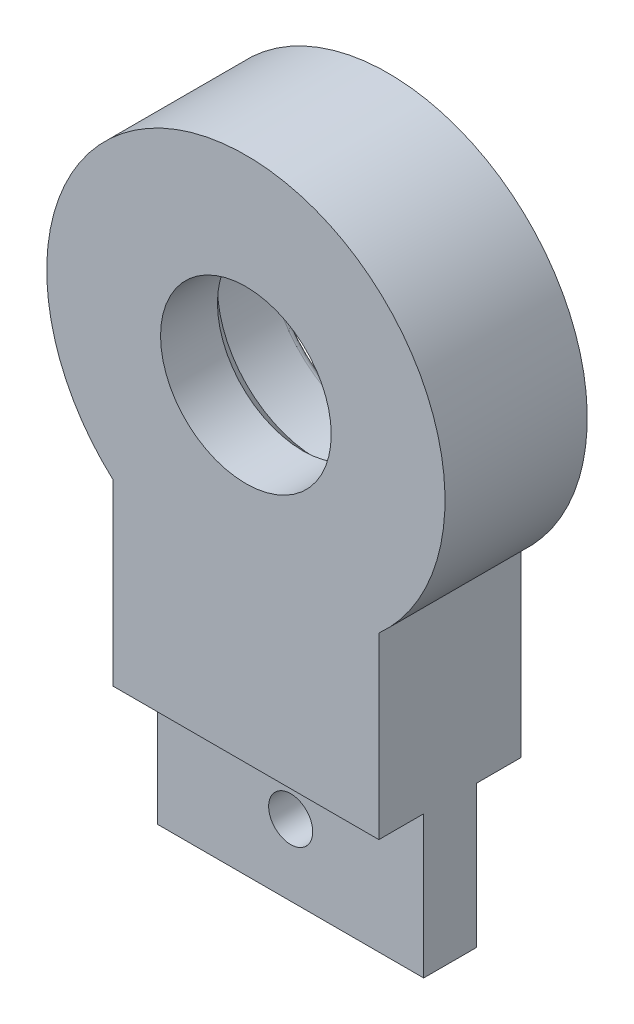
ISO-10303-21;
HEADER;
FILE_DESCRIPTION(('STEP AP214'),'2;1');
FILE_NAME('part.step','',(''),(''),'','','');
FILE_SCHEMA(('AUTOMOTIVE_DESIGN { 1 0 10303 214 1 1 1 1 }'));
ENDSEC;
DATA;
#1=APPLICATION_CONTEXT('core data for automotive mechanical design processes');
#2=APPLICATION_PROTOCOL_DEFINITION('international standard','automotive_design',2000,#1);
#3=PRODUCT_CONTEXT('',#1,'mechanical');
#4=PRODUCT('Part','Part','',(#3));
#5=PRODUCT_RELATED_PRODUCT_CATEGORY('part','',(#4));
#6=PRODUCT_DEFINITION_FORMATION('','',#4);
#7=PRODUCT_DEFINITION_CONTEXT('part definition',#1,'design');
#8=PRODUCT_DEFINITION('design','',#6,#7);
#9=PRODUCT_DEFINITION_SHAPE('','',#8);
#10=(LENGTH_UNIT() NAMED_UNIT(*) SI_UNIT(.MILLI.,.METRE.));
#11=(NAMED_UNIT(*) PLANE_ANGLE_UNIT() SI_UNIT($,.RADIAN.));
#12=(NAMED_UNIT(*) SI_UNIT($,.STERADIAN.) SOLID_ANGLE_UNIT());
#13=UNCERTAINTY_MEASURE_WITH_UNIT(LENGTH_MEASURE(1.E-05),#10,'distance_accuracy_value','');
#14=(GEOMETRIC_REPRESENTATION_CONTEXT(3) GLOBAL_UNCERTAINTY_ASSIGNED_CONTEXT((#13)) GLOBAL_UNIT_ASSIGNED_CONTEXT((#10,
#11,#12)) REPRESENTATION_CONTEXT('',''));
#15=CARTESIAN_POINT('',(0.,0.,0.));
#16=DIRECTION('',(0.,0.,1.));
#17=DIRECTION('',(1.,0.,0.));
#18=AXIS2_PLACEMENT_3D('',#15,#16,#17);
#19=CARTESIAN_POINT('',(0.,5.50000000000001,10.));
#20=DIRECTION('',(0.,0.,-1.));
#21=DIRECTION('',(-1.,0.,0.));
#22=AXIS2_PLACEMENT_3D('',#19,#20,#21);
#23=CYLINDRICAL_SURFACE('',#22,8.);
#24=CARTESIAN_POINT('',(0.,5.50000000000001,0.5));
#25=DIRECTION('',(0.,0.,1.));
#26=DIRECTION('',(1.,0.,0.));
#27=AXIS2_PLACEMENT_3D('',#24,#25,#26);
#28=CIRCLE('',#27,8.);
#29=CARTESIAN_POINT('',(8.,5.50000000000001,0.5));
#30=VERTEX_POINT('',#29);
#31=EDGE_CURVE('E11',#30,#30,#28,.F.);
#32=ORIENTED_EDGE('',*,*,#31,.T.);
#33=EDGE_LOOP('',(#32));
#34=FACE_BOUND('',#33,.T.);
#35=CARTESIAN_POINT('',(0.,5.50000000000001,5.));
#36=DIRECTION('',(0.,0.,1.));
#37=DIRECTION('',(1.,0.,0.));
#38=AXIS2_PLACEMENT_3D('',#35,#36,#37);
#39=CIRCLE('',#38,8.);
#40=CARTESIAN_POINT('',(8.,5.50000000000001,5.));
#41=VERTEX_POINT('',#40);
#42=EDGE_CURVE('E343',#41,#41,#39,.T.);
#43=ORIENTED_EDGE('',*,*,#42,.T.);
#44=EDGE_LOOP('',(#43));
#45=FACE_BOUND('',#44,.T.);
#46=ADVANCED_FACE('F33',(#34,#45),#23,.F.);
#47=CARTESIAN_POINT('',(-9.35,-17.5,10.));
#48=DIRECTION('',(0.,1.,0.));
#49=DIRECTION('',(0.,0.,1.));
#50=AXIS2_PLACEMENT_3D('',#47,#48,#49);
#51=PLANE('',#50);
#52=DIRECTION('',(0.,0.,-1.));
#53=VECTOR('',#52,1.);
#54=CARTESIAN_POINT('',(9.35,-17.5,10.));
#55=LINE('',#54,#53);
#56=CARTESIAN_POINT('',(9.35,-17.5,3.15));
#57=VERTEX_POINT('',#56);
#58=CARTESIAN_POINT('',(9.35,-17.5,0.));
#59=VERTEX_POINT('',#58);
#60=EDGE_CURVE('E76',#57,#59,#55,.T.);
#61=ORIENTED_EDGE('',*,*,#60,.F.);
#62=DIRECTION('',(-1.,0.,0.));
#63=VECTOR('',#62,1.);
#64=CARTESIAN_POINT('',(-9.35,-17.5,3.15));
#65=LINE('',#64,#63);
#66=CARTESIAN_POINT('',(-9.35,-17.5,3.15));
#67=VERTEX_POINT('',#66);
#68=EDGE_CURVE('E167',#57,#67,#65,.T.);
#69=ORIENTED_EDGE('',*,*,#68,.T.);
#70=DIRECTION('',(0.,0.,-1.));
#71=VECTOR('',#70,1.);
#72=CARTESIAN_POINT('',(-9.35,-17.5,10.));
#73=LINE('',#72,#71);
#74=CARTESIAN_POINT('',(-9.35,-17.5,0.));
#75=VERTEX_POINT('',#74);
#76=EDGE_CURVE('E158',#67,#75,#73,.T.);
#77=ORIENTED_EDGE('',*,*,#76,.T.);
#78=DIRECTION('',(1.,0.,0.));
#79=VECTOR('',#78,1.);
#80=CARTESIAN_POINT('',(-9.35,-17.5,0.));
#81=LINE('',#80,#79);
#82=EDGE_CURVE('E143',#75,#59,#81,.T.);
#83=ORIENTED_EDGE('',*,*,#82,.T.);
#84=EDGE_LOOP('',(#61,#69,#77,#83));
#85=FACE_BOUND('',#84,.T.);
#86=ADVANCED_FACE('F191',(#85),#51,.F.);
#87=CARTESIAN_POINT('',(0.,5.50000000000001,10.));
#88=DIRECTION('',(0.,0.,1.));
#89=DIRECTION('',(1.,0.,0.));
#90=AXIS2_PLACEMENT_3D('',#87,#88,#89);
#91=PLANE('',#90);
#92=DIRECTION('',(0.,1.,0.));
#93=VECTOR('',#92,1.);
#94=CARTESIAN_POINT('',(9.35,-4.92005278297571,10.));
#95=LINE('',#94,#93);
#96=CARTESIAN_POINT('',(9.35,-17.5,10.));
#97=VERTEX_POINT('',#96);
#98=CARTESIAN_POINT('',(9.35,-4.92005278297571,10.));
#99=VERTEX_POINT('',#98);
#100=EDGE_CURVE('E141',#97,#99,#95,.T.);
#101=ORIENTED_EDGE('',*,*,#100,.T.);
#102=CARTESIAN_POINT('',(0.,5.50000000000001,10.));
#103=DIRECTION('',(0.,0.,1.));
#104=DIRECTION('',(1.,0.,0.));
#105=AXIS2_PLACEMENT_3D('',#102,#103,#104);
#106=CIRCLE('',#105,14.);
#107=CARTESIAN_POINT('',(-9.35,-4.92005278297571,10.));
#108=VERTEX_POINT('',#107);
#109=EDGE_CURVE('E84',#99,#108,#106,.T.);
#110=ORIENTED_EDGE('',*,*,#109,.T.);
#111=DIRECTION('',(0.,-1.,0.));
#112=VECTOR('',#111,1.);
#113=CARTESIAN_POINT('',(-9.35,-4.92005278297571,10.));
#114=LINE('',#113,#112);
#115=CARTESIAN_POINT('',(-9.35,-17.5,10.));
#116=VERTEX_POINT('',#115);
#117=EDGE_CURVE('E145',#108,#116,#114,.T.);
#118=ORIENTED_EDGE('',*,*,#117,.T.);
#119=DIRECTION('',(1.,0.,0.));
#120=VECTOR('',#119,1.);
#121=CARTESIAN_POINT('',(-9.35,-17.5,10.));
#122=LINE('',#121,#120);
#123=EDGE_CURVE('E57',#116,#97,#122,.T.);
#124=ORIENTED_EDGE('',*,*,#123,.T.);
#125=EDGE_LOOP('',(#101,#110,#118,#124));
#126=FACE_BOUND('',#125,.T.);
#127=CARTESIAN_POINT('',(0.,5.50000000000001,10.));
#128=DIRECTION('',(0.,0.,1.));
#129=DIRECTION('',(1.,0.,0.));
#130=AXIS2_PLACEMENT_3D('',#127,#128,#129);
#131=CIRCLE('',#130,6.);
#132=CARTESIAN_POINT('',(6.,5.50000000000001,10.));
#133=VERTEX_POINT('',#132);
#134=EDGE_CURVE('E341',#133,#133,#131,.T.);
#135=ORIENTED_EDGE('',*,*,#134,.F.);
#136=EDGE_LOOP('',(#135));
#137=FACE_BOUND('',#136,.T.);
#138=ADVANCED_FACE('F197',(#126,#137),#91,.T.);
#139=CARTESIAN_POINT('',(0.,5.50000000000001,0.));
#140=DIRECTION('',(0.,0.,1.));
#141=DIRECTION('',(1.,0.,0.));
#142=AXIS2_PLACEMENT_3D('',#139,#140,#141);
#143=PLANE('',#142);
#144=CARTESIAN_POINT('',(0.,5.50000000000001,0.));
#145=DIRECTION('',(0.,0.,1.));
#146=DIRECTION('',(1.,0.,0.));
#147=AXIS2_PLACEMENT_3D('',#144,#145,#146);
#148=CIRCLE('',#147,8.5);
#149=CARTESIAN_POINT('',(8.5,5.50000000000001,0.));
#150=VERTEX_POINT('',#149);
#151=EDGE_CURVE('E41',#150,#150,#148,.T.);
#152=ORIENTED_EDGE('',*,*,#151,.T.);
#153=EDGE_LOOP('',(#152));
#154=FACE_BOUND('',#153,.T.);
#155=DIRECTION('',(0.,1.,0.));
#156=VECTOR('',#155,1.);
#157=CARTESIAN_POINT('',(9.35,-4.92005278297571,0.));
#158=LINE('',#157,#156);
#159=CARTESIAN_POINT('',(9.35,-4.92005278297571,0.));
#160=VERTEX_POINT('',#159);
#161=EDGE_CURVE('E139',#59,#160,#158,.T.);
#162=ORIENTED_EDGE('',*,*,#161,.F.);
#163=ORIENTED_EDGE('',*,*,#82,.F.);
#164=DIRECTION('',(0.,-1.,0.));
#165=VECTOR('',#164,1.);
#166=CARTESIAN_POINT('',(-9.35,-4.92005278297571,0.));
#167=LINE('',#166,#165);
#168=CARTESIAN_POINT('',(-9.35,-4.92005278297571,0.));
#169=VERTEX_POINT('',#168);
#170=EDGE_CURVE('E151',#169,#75,#167,.T.);
#171=ORIENTED_EDGE('',*,*,#170,.F.);
#172=CARTESIAN_POINT('',(0.,5.50000000000001,0.));
#173=DIRECTION('',(0.,0.,1.));
#174=DIRECTION('',(1.,0.,0.));
#175=AXIS2_PLACEMENT_3D('',#172,#173,#174);
#176=CIRCLE('',#175,14.);
#177=EDGE_CURVE('E149',#160,#169,#176,.T.);
#178=ORIENTED_EDGE('',*,*,#177,.F.);
#179=EDGE_LOOP('',(#162,#163,#171,#178));
#180=FACE_BOUND('',#179,.T.);
#181=ADVANCED_FACE('F178',(#154,#180),#143,.F.);
#182=CARTESIAN_POINT('',(9.35,-4.92005278297571,10.));
#183=DIRECTION('',(-1.,0.,0.));
#184=DIRECTION('',(0.,0.,1.));
#185=AXIS2_PLACEMENT_3D('',#182,#183,#184);
#186=PLANE('',#185);
#187=DIRECTION('',(0.,1.,0.));
#188=VECTOR('',#187,1.);
#189=CARTESIAN_POINT('',(9.35,-7.5,3.15));
#190=LINE('',#189,#188);
#191=CARTESIAN_POINT('',(9.35,-27.5,3.15));
#192=VERTEX_POINT('',#191);
#193=EDGE_CURVE('E48',#192,#57,#190,.T.);
#194=ORIENTED_EDGE('',*,*,#193,.T.);
#195=ORIENTED_EDGE('',*,*,#60,.T.);
#196=ORIENTED_EDGE('',*,*,#161,.T.);
#197=DIRECTION('',(0.,0.,-1.));
#198=VECTOR('',#197,1.);
#199=CARTESIAN_POINT('',(9.35,-4.92005278297571,10.));
#200=LINE('',#199,#198);
#201=EDGE_CURVE('E164',#99,#160,#200,.T.);
#202=ORIENTED_EDGE('',*,*,#201,.F.);
#203=ORIENTED_EDGE('',*,*,#100,.F.);
#204=CARTESIAN_POINT('',(9.35,-17.5,6.85));
#205=VERTEX_POINT('',#204);
#206=EDGE_CURVE('E155',#97,#205,#55,.T.);
#207=ORIENTED_EDGE('',*,*,#206,.T.);
#208=DIRECTION('',(0.,-1.,0.));
#209=VECTOR('',#208,1.);
#210=CARTESIAN_POINT('',(9.35,-7.5,6.85));
#211=LINE('',#210,#209);
#212=CARTESIAN_POINT('',(9.35,-27.5,6.85));
#213=VERTEX_POINT('',#212);
#214=EDGE_CURVE('E135',#205,#213,#211,.T.);
#215=ORIENTED_EDGE('',*,*,#214,.T.);
#216=DIRECTION('',(0.,0.,-1.));
#217=VECTOR('',#216,1.);
#218=CARTESIAN_POINT('',(9.35,-27.5,6.85));
#219=LINE('',#218,#217);
#220=EDGE_CURVE('E125',#213,#192,#219,.T.);
#221=ORIENTED_EDGE('',*,*,#220,.T.);
#222=EDGE_LOOP('',(#194,#195,#196,#202,#203,#207,#215,#221));
#223=FACE_BOUND('',#222,.T.);
#224=ADVANCED_FACE('F209',(#223),#186,.F.);
#225=CARTESIAN_POINT('',(0.,5.50000000000001,10.));
#226=DIRECTION('',(0.,0.,-1.));
#227=DIRECTION('',(-1.,0.,0.));
#228=AXIS2_PLACEMENT_3D('',#225,#226,#227);
#229=CYLINDRICAL_SURFACE('',#228,14.);
#230=ORIENTED_EDGE('',*,*,#177,.T.);
#231=DIRECTION('',(0.,0.,-1.));
#232=VECTOR('',#231,1.);
#233=CARTESIAN_POINT('',(-9.35,-4.92005278297571,10.));
#234=LINE('',#233,#232);
#235=EDGE_CURVE('E161',#108,#169,#234,.T.);
#236=ORIENTED_EDGE('',*,*,#235,.F.);
#237=ORIENTED_EDGE('',*,*,#109,.F.);
#238=ORIENTED_EDGE('',*,*,#201,.T.);
#239=EDGE_LOOP('',(#230,#236,#237,#238));
#240=FACE_BOUND('',#239,.T.);
#241=ADVANCED_FACE('F215',(#240),#229,.T.);
#242=CARTESIAN_POINT('',(-9.35,-4.92005278297571,10.));
#243=DIRECTION('',(1.,0.,0.));
#244=DIRECTION('',(0.,1.,0.));
#245=AXIS2_PLACEMENT_3D('',#242,#243,#244);
#246=PLANE('',#245);
#247=DIRECTION('',(0.,-1.,0.));
#248=VECTOR('',#247,1.);
#249=CARTESIAN_POINT('',(-9.35,-7.5,6.85));
#250=LINE('',#249,#248);
#251=CARTESIAN_POINT('',(-9.35,-17.5,6.85));
#252=VERTEX_POINT('',#251);
#253=CARTESIAN_POINT('',(-9.35,-27.5,6.85));
#254=VERTEX_POINT('',#253);
#255=EDGE_CURVE('E108',#252,#254,#250,.T.);
#256=ORIENTED_EDGE('',*,*,#255,.F.);
#257=EDGE_CURVE('E159',#116,#252,#73,.T.);
#258=ORIENTED_EDGE('',*,*,#257,.F.);
#259=ORIENTED_EDGE('',*,*,#117,.F.);
#260=ORIENTED_EDGE('',*,*,#235,.T.);
#261=ORIENTED_EDGE('',*,*,#170,.T.);
#262=ORIENTED_EDGE('',*,*,#76,.F.);
#263=DIRECTION('',(0.,1.,0.));
#264=VECTOR('',#263,1.);
#265=CARTESIAN_POINT('',(-9.35,-7.5,3.15));
#266=LINE('',#265,#264);
#267=CARTESIAN_POINT('',(-9.35,-27.5,3.15));
#268=VERTEX_POINT('',#267);
#269=EDGE_CURVE('E120',#268,#67,#266,.T.);
#270=ORIENTED_EDGE('',*,*,#269,.F.);
#271=DIRECTION('',(0.,0.,-1.));
#272=VECTOR('',#271,1.);
#273=CARTESIAN_POINT('',(-9.35,-27.5,6.85));
#274=LINE('',#273,#272);
#275=EDGE_CURVE('E119',#254,#268,#274,.T.);
#276=ORIENTED_EDGE('',*,*,#275,.F.);
#277=EDGE_LOOP('',(#256,#258,#259,#260,#261,#262,#270,#276));
#278=FACE_BOUND('',#277,.T.);
#279=ADVANCED_FACE('F129',(#278),#246,.F.);
#280=ORIENTED_EDGE('',*,*,#257,.T.);
#281=DIRECTION('',(1.,0.,0.));
#282=VECTOR('',#281,1.);
#283=CARTESIAN_POINT('',(-9.35,-17.5,6.85));
#284=LINE('',#283,#282);
#285=EDGE_CURVE('E114',#252,#205,#284,.T.);
#286=ORIENTED_EDGE('',*,*,#285,.T.);
#287=ORIENTED_EDGE('',*,*,#206,.F.);
#288=ORIENTED_EDGE('',*,*,#123,.F.);
#289=EDGE_LOOP('',(#280,#286,#287,#288));
#290=FACE_BOUND('',#289,.T.);
#291=ADVANCED_FACE('F200',(#290),#51,.F.);
#292=CARTESIAN_POINT('',(-9.35,-7.5,3.15));
#293=DIRECTION('',(0.,0.,-1.));
#294=DIRECTION('',(0.,1.,0.));
#295=AXIS2_PLACEMENT_3D('',#292,#293,#294);
#296=PLANE('',#295);
#297=CARTESIAN_POINT('',(0.,-22.5,3.15));
#298=DIRECTION('',(0.,0.,-1.));
#299=DIRECTION('',(0.,1.,0.));
#300=AXIS2_PLACEMENT_3D('',#297,#298,#299);
#301=CIRCLE('',#300,1.55);
#302=CARTESIAN_POINT('',(0.,-20.95,3.15));
#303=VERTEX_POINT('',#302);
#304=EDGE_CURVE('E136',#303,#303,#301,.T.);
#305=ORIENTED_EDGE('',*,*,#304,.F.);
#306=EDGE_LOOP('',(#305));
#307=FACE_BOUND('',#306,.T.);
#308=ORIENTED_EDGE('',*,*,#68,.F.);
#309=ORIENTED_EDGE('',*,*,#193,.F.);
#310=DIRECTION('',(1.,0.,0.));
#311=VECTOR('',#310,1.);
#312=CARTESIAN_POINT('',(-9.35,-27.5,3.15));
#313=LINE('',#312,#311);
#314=EDGE_CURVE('E126',#268,#192,#313,.T.);
#315=ORIENTED_EDGE('',*,*,#314,.F.);
#316=ORIENTED_EDGE('',*,*,#269,.T.);
#317=EDGE_LOOP('',(#308,#309,#315,#316));
#318=FACE_BOUND('',#317,.T.);
#319=ADVANCED_FACE('F204',(#307,#318),#296,.T.);
#320=CARTESIAN_POINT('',(-9.35,-7.5,6.85));
#321=DIRECTION('',(0.,0.,1.));
#322=DIRECTION('',(0.,-1.,0.));
#323=AXIS2_PLACEMENT_3D('',#320,#321,#322);
#324=PLANE('',#323);
#325=CARTESIAN_POINT('',(0.,-22.5,6.85));
#326=DIRECTION('',(0.,0.,1.));
#327=DIRECTION('',(1.,0.,0.));
#328=AXIS2_PLACEMENT_3D('',#325,#326,#327);
#329=CIRCLE('',#328,1.55);
#330=CARTESIAN_POINT('',(1.55,-22.5,6.85));
#331=VERTEX_POINT('',#330);
#332=EDGE_CURVE('E346',#331,#331,#329,.T.);
#333=ORIENTED_EDGE('',*,*,#332,.F.);
#334=EDGE_LOOP('',(#333));
#335=FACE_BOUND('',#334,.T.);
#336=ORIENTED_EDGE('',*,*,#285,.F.);
#337=ORIENTED_EDGE('',*,*,#255,.T.);
#338=DIRECTION('',(1.,0.,0.));
#339=VECTOR('',#338,1.);
#340=CARTESIAN_POINT('',(-9.35,-27.5,6.85));
#341=LINE('',#340,#339);
#342=EDGE_CURVE('E111',#254,#213,#341,.T.);
#343=ORIENTED_EDGE('',*,*,#342,.T.);
#344=ORIENTED_EDGE('',*,*,#214,.F.);
#345=EDGE_LOOP('',(#336,#337,#343,#344));
#346=FACE_BOUND('',#345,.T.);
#347=ADVANCED_FACE('F110',(#335,#346),#324,.T.);
#348=CARTESIAN_POINT('',(-9.35,-27.5,6.85));
#349=DIRECTION('',(0.,-1.,0.));
#350=DIRECTION('',(1.,0.,0.));
#351=AXIS2_PLACEMENT_3D('',#348,#349,#350);
#352=PLANE('',#351);
#353=ORIENTED_EDGE('',*,*,#220,.F.);
#354=ORIENTED_EDGE('',*,*,#342,.F.);
#355=ORIENTED_EDGE('',*,*,#275,.T.);
#356=ORIENTED_EDGE('',*,*,#314,.T.);
#357=EDGE_LOOP('',(#353,#354,#355,#356));
#358=FACE_BOUND('',#357,.T.);
#359=ADVANCED_FACE('F124',(#358),#352,.T.);
#360=CARTESIAN_POINT('',(0.,-22.5,-11.85));
#361=DIRECTION('',(0.,0.,1.));
#362=DIRECTION('',(1.,0.,0.));
#363=AXIS2_PLACEMENT_3D('',#360,#361,#362);
#364=CYLINDRICAL_SURFACE('',#363,1.55);
#365=ORIENTED_EDGE('',*,*,#304,.T.);
#366=EDGE_LOOP('',(#365));
#367=FACE_BOUND('',#366,.T.);
#368=ORIENTED_EDGE('',*,*,#332,.T.);
#369=EDGE_LOOP('',(#368));
#370=FACE_BOUND('',#369,.T.);
#371=ADVANCED_FACE('F255',(#367,#370),#364,.F.);
#372=CARTESIAN_POINT('',(0.,5.50000000000001,5.));
#373=DIRECTION('',(0.,0.,1.));
#374=DIRECTION('',(1.,0.,0.));
#375=AXIS2_PLACEMENT_3D('',#372,#373,#374);
#376=PLANE('',#375);
#377=CARTESIAN_POINT('',(0.,5.50000000000001,5.));
#378=DIRECTION('',(0.,0.,1.));
#379=DIRECTION('',(1.,0.,0.));
#380=AXIS2_PLACEMENT_3D('',#377,#378,#379);
#381=CIRCLE('',#380,6.99999999999999);
#382=CARTESIAN_POINT('',(6.99999999999999,5.50000000000001,5.));
#383=VERTEX_POINT('',#382);
#384=EDGE_CURVE('E170',#383,#383,#381,.T.);
#385=ORIENTED_EDGE('',*,*,#384,.T.);
#386=EDGE_LOOP('',(#385));
#387=FACE_BOUND('',#386,.T.);
#388=ORIENTED_EDGE('',*,*,#42,.F.);
#389=EDGE_LOOP('',(#388));
#390=FACE_BOUND('',#389,.T.);
#391=ADVANCED_FACE('F261',(#387,#390),#376,.F.);
#392=CARTESIAN_POINT('',(0.,5.50000000000001,5.));
#393=DIRECTION('',(0.,0.,1.));
#394=DIRECTION('',(1.,0.,0.));
#395=AXIS2_PLACEMENT_3D('',#392,#393,#394);
#396=CYLINDRICAL_SURFACE('',#395,6.);
#397=CARTESIAN_POINT('',(0.,5.50000000000001,5.99999999999999));
#398=DIRECTION('',(0.,0.,1.));
#399=DIRECTION('',(1.,0.,0.));
#400=AXIS2_PLACEMENT_3D('',#397,#398,#399);
#401=CIRCLE('',#400,6.);
#402=CARTESIAN_POINT('',(6.,5.50000000000001,5.99999999999999));
#403=VERTEX_POINT('',#402);
#404=EDGE_CURVE('E173',#403,#403,#401,.F.);
#405=ORIENTED_EDGE('',*,*,#404,.T.);
#406=EDGE_LOOP('',(#405));
#407=FACE_BOUND('',#406,.T.);
#408=ORIENTED_EDGE('',*,*,#134,.T.);
#409=EDGE_LOOP('',(#408));
#410=FACE_BOUND('',#409,.T.);
#411=ADVANCED_FACE('F187',(#407,#410),#396,.F.);
#412=CARTESIAN_POINT('',(0.,5.50000000000001,5.));
#413=DIRECTION('',(0.,0.,-1.));
#414=DIRECTION('',(-1.,0.,0.));
#415=AXIS2_PLACEMENT_3D('',#412,#413,#414);
#416=CONICAL_SURFACE('',#415,6.99999999999999,0.785398163397449);
#417=ORIENTED_EDGE('',*,*,#404,.F.);
#418=EDGE_LOOP('',(#417));
#419=FACE_BOUND('',#418,.T.);
#420=ORIENTED_EDGE('',*,*,#384,.F.);
#421=EDGE_LOOP('',(#420));
#422=FACE_BOUND('',#421,.T.);
#423=ADVANCED_FACE('F182',(#419,#422),#416,.F.);
#424=CARTESIAN_POINT('',(0.,5.50000000000001,0.5));
#425=DIRECTION('',(0.,0.,1.));
#426=DIRECTION('',(1.,0.,0.));
#427=AXIS2_PLACEMENT_3D('',#424,#425,#426);
#428=TOROIDAL_SURFACE('',#427,8.5,0.5);
#429=ORIENTED_EDGE('',*,*,#31,.F.);
#430=EDGE_LOOP('',(#429));
#431=FACE_BOUND('',#430,.T.);
#432=ORIENTED_EDGE('',*,*,#151,.F.);
#433=EDGE_LOOP('',(#432));
#434=FACE_BOUND('',#433,.T.);
#435=ADVANCED_FACE('F35',(#431,#434),#428,.T.);
#436=CLOSED_SHELL('',(#46,#86,#138,#181,#224,#241,#279,#291,#319,#347,#359,#371,#391,#411,#423,#435));
#437=MANIFOLD_SOLID_BREP('B2',#436);
#438=ADVANCED_BREP_SHAPE_REPRESENTATION('',(#18,#437),#14);
#439=SHAPE_DEFINITION_REPRESENTATION(#9,#438);
ENDSEC;
END-ISO-10303-21;
